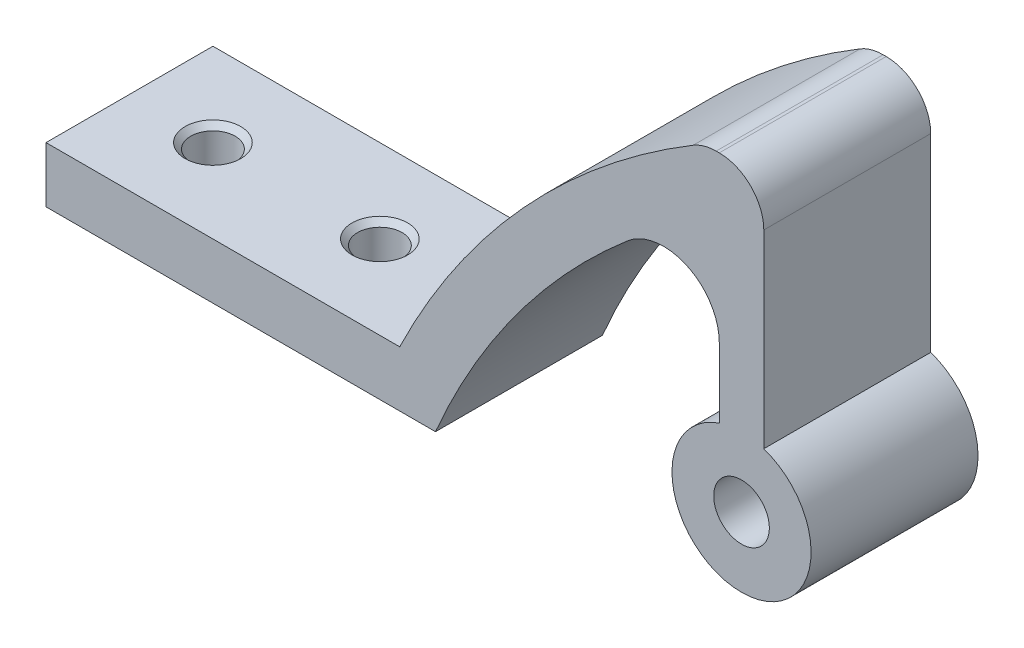
ISO-10303-21;
HEADER;
FILE_DESCRIPTION(('STEP AP214'),'2;1');
FILE_NAME('part.step','',(''),(''),'','','');
FILE_SCHEMA(('AUTOMOTIVE_DESIGN { 1 0 10303 214 1 1 1 1 }'));
ENDSEC;
DATA;
#1=APPLICATION_CONTEXT('core data for automotive mechanical design processes');
#2=APPLICATION_PROTOCOL_DEFINITION('international standard','automotive_design',2000,#1);
#3=PRODUCT_CONTEXT('',#1,'mechanical');
#4=PRODUCT('Part','Part','',(#3));
#5=PRODUCT_RELATED_PRODUCT_CATEGORY('part','',(#4));
#6=PRODUCT_DEFINITION_FORMATION('','',#4);
#7=PRODUCT_DEFINITION_CONTEXT('part definition',#1,'design');
#8=PRODUCT_DEFINITION('design','',#6,#7);
#9=PRODUCT_DEFINITION_SHAPE('','',#8);
#10=(LENGTH_UNIT() NAMED_UNIT(*) SI_UNIT(.MILLI.,.METRE.));
#11=(NAMED_UNIT(*) PLANE_ANGLE_UNIT() SI_UNIT($,.RADIAN.));
#12=(NAMED_UNIT(*) SI_UNIT($,.STERADIAN.) SOLID_ANGLE_UNIT());
#13=UNCERTAINTY_MEASURE_WITH_UNIT(LENGTH_MEASURE(1.E-05),#10,'distance_accuracy_value','');
#14=(GEOMETRIC_REPRESENTATION_CONTEXT(3) GLOBAL_UNCERTAINTY_ASSIGNED_CONTEXT((#13)) GLOBAL_UNIT_ASSIGNED_CONTEXT((#10,
#11,#12)) REPRESENTATION_CONTEXT('',''));
#15=CARTESIAN_POINT('',(0.,0.,0.));
#16=DIRECTION('',(0.,0.,1.));
#17=DIRECTION('',(1.,0.,0.));
#18=AXIS2_PLACEMENT_3D('',#15,#16,#17);
#19=CARTESIAN_POINT('',(0.,5.,0.));
#20=DIRECTION('',(0.,1.,0.));
#21=DIRECTION('',(0.,0.,1.));
#22=AXIS2_PLACEMENT_3D('',#19,#20,#21);
#23=PLANE('',#22);
#24=CARTESIAN_POINT('',(5.,5.,0.));
#25=DIRECTION('',(0.,1.,0.));
#26=DIRECTION('',(0.,0.,1.));
#27=AXIS2_PLACEMENT_3D('',#24,#25,#26);
#28=CIRCLE('',#27,2.50000000000002);
#29=CARTESIAN_POINT('',(5.,5.,2.50000000000002));
#30=VERTEX_POINT('',#29);
#31=EDGE_CURVE('E49',#30,#30,#28,.F.);
#32=ORIENTED_EDGE('',*,*,#31,.T.);
#33=EDGE_LOOP('',(#32));
#34=FACE_BOUND('',#33,.T.);
#35=CARTESIAN_POINT('',(-10.,5.,0.));
#36=DIRECTION('',(0.,1.,0.));
#37=DIRECTION('',(0.,0.,1.));
#38=AXIS2_PLACEMENT_3D('',#35,#36,#37);
#39=CIRCLE('',#38,2.50000000000002);
#40=CARTESIAN_POINT('',(-10.,5.,2.50000000000002));
#41=VERTEX_POINT('',#40);
#42=EDGE_CURVE('E216',#41,#41,#39,.F.);
#43=ORIENTED_EDGE('',*,*,#42,.T.);
#44=EDGE_LOOP('',(#43));
#45=FACE_BOUND('',#44,.T.);
#46=DIRECTION('',(0.,0.,1.));
#47=VECTOR('',#46,1.);
#48=CARTESIAN_POINT('',(14.2847197685974,5.,-7.5));
#49=LINE('',#48,#47);
#50=CARTESIAN_POINT('',(14.2847197685974,5.,-7.5));
#51=VERTEX_POINT('',#50);
#52=CARTESIAN_POINT('',(14.2847197685974,5.,7.5));
#53=VERTEX_POINT('',#52);
#54=EDGE_CURVE('E60',#51,#53,#49,.T.);
#55=ORIENTED_EDGE('',*,*,#54,.F.);
#56=DIRECTION('',(-1.,0.,0.));
#57=VECTOR('',#56,1.);
#58=CARTESIAN_POINT('',(17.5,5.,-7.5));
#59=LINE('',#58,#57);
#60=CARTESIAN_POINT('',(-17.5,5.,-7.5));
#61=VERTEX_POINT('',#60);
#62=EDGE_CURVE('E195',#51,#61,#59,.T.);
#63=ORIENTED_EDGE('',*,*,#62,.T.);
#64=DIRECTION('',(0.,0.,1.));
#65=VECTOR('',#64,1.);
#66=CARTESIAN_POINT('',(-17.5,5.,7.5));
#67=LINE('',#66,#65);
#68=CARTESIAN_POINT('',(-17.5,5.,7.5));
#69=VERTEX_POINT('',#68);
#70=EDGE_CURVE('E191',#61,#69,#67,.T.);
#71=ORIENTED_EDGE('',*,*,#70,.T.);
#72=DIRECTION('',(1.,0.,0.));
#73=VECTOR('',#72,1.);
#74=CARTESIAN_POINT('',(17.5,5.,7.5));
#75=LINE('',#74,#73);
#76=EDGE_CURVE('E56',#69,#53,#75,.T.);
#77=ORIENTED_EDGE('',*,*,#76,.T.);
#78=EDGE_LOOP('',(#55,#63,#71,#77));
#79=FACE_BOUND('',#78,.T.);
#80=ADVANCED_FACE('F40',(#34,#45,#79),#23,.T.);
#81=CARTESIAN_POINT('',(0.,0.,0.));
#82=DIRECTION('',(0.,1.,0.));
#83=DIRECTION('',(0.,0.,1.));
#84=AXIS2_PLACEMENT_3D('',#81,#82,#83);
#85=PLANE('',#84);
#86=DIRECTION('',(0.,0.,1.));
#87=VECTOR('',#86,1.);
#88=CARTESIAN_POINT('',(-17.5,0.,7.5));
#89=LINE('',#88,#87);
#90=CARTESIAN_POINT('',(-17.5,0.,-7.5));
#91=VERTEX_POINT('',#90);
#92=CARTESIAN_POINT('',(-17.5,0.,7.5));
#93=VERTEX_POINT('',#92);
#94=EDGE_CURVE('E190',#91,#93,#89,.T.);
#95=ORIENTED_EDGE('',*,*,#94,.F.);
#96=DIRECTION('',(-1.,0.,0.));
#97=VECTOR('',#96,1.);
#98=CARTESIAN_POINT('',(17.5,0.,-7.5));
#99=LINE('',#98,#97);
#100=CARTESIAN_POINT('',(17.5,0.,-7.5));
#101=VERTEX_POINT('',#100);
#102=EDGE_CURVE('E193',#101,#91,#99,.T.);
#103=ORIENTED_EDGE('',*,*,#102,.F.);
#104=DIRECTION('',(0.,0.,-1.));
#105=VECTOR('',#104,1.);
#106=CARTESIAN_POINT('',(17.5,0.,7.5));
#107=LINE('',#106,#105);
#108=CARTESIAN_POINT('',(17.5,0.,7.5));
#109=VERTEX_POINT('',#108);
#110=EDGE_CURVE('E202',#109,#101,#107,.T.);
#111=ORIENTED_EDGE('',*,*,#110,.F.);
#112=DIRECTION('',(1.,0.,0.));
#113=VECTOR('',#112,1.);
#114=CARTESIAN_POINT('',(17.5,0.,7.5));
#115=LINE('',#114,#113);
#116=EDGE_CURVE('E200',#93,#109,#115,.T.);
#117=ORIENTED_EDGE('',*,*,#116,.F.);
#118=EDGE_LOOP('',(#95,#103,#111,#117));
#119=FACE_BOUND('',#118,.T.);
#120=CARTESIAN_POINT('',(-10.,0.,0.));
#121=DIRECTION('',(0.,1.,0.));
#122=DIRECTION('',(0.,0.,1.));
#123=AXIS2_PLACEMENT_3D('',#120,#121,#122);
#124=CIRCLE('',#123,2.);
#125=CARTESIAN_POINT('',(-10.,0.,2.));
#126=VERTEX_POINT('',#125);
#127=EDGE_CURVE('E187',#126,#126,#124,.T.);
#128=ORIENTED_EDGE('',*,*,#127,.T.);
#129=EDGE_LOOP('',(#128));
#130=FACE_BOUND('',#129,.T.);
#131=CARTESIAN_POINT('',(5.,0.,0.));
#132=DIRECTION('',(0.,1.,0.));
#133=DIRECTION('',(0.,0.,1.));
#134=AXIS2_PLACEMENT_3D('',#131,#132,#133);
#135=CIRCLE('',#134,2.);
#136=CARTESIAN_POINT('',(5.,0.,2.));
#137=VERTEX_POINT('',#136);
#138=EDGE_CURVE('E184',#137,#137,#135,.T.);
#139=ORIENTED_EDGE('',*,*,#138,.T.);
#140=EDGE_LOOP('',(#139));
#141=FACE_BOUND('',#140,.T.);
#142=ADVANCED_FACE('F237',(#119,#130,#141),#85,.F.);
#143=CARTESIAN_POINT('',(-17.5,5.,7.5));
#144=DIRECTION('',(1.,0.,0.));
#145=DIRECTION('',(0.,0.,-1.));
#146=AXIS2_PLACEMENT_3D('',#143,#144,#145);
#147=PLANE('',#146);
#148=ORIENTED_EDGE('',*,*,#94,.T.);
#149=DIRECTION('',(0.,-1.,0.));
#150=VECTOR('',#149,1.);
#151=CARTESIAN_POINT('',(-17.5,5.,7.5));
#152=LINE('',#151,#150);
#153=EDGE_CURVE('E208',#69,#93,#152,.T.);
#154=ORIENTED_EDGE('',*,*,#153,.F.);
#155=ORIENTED_EDGE('',*,*,#70,.F.);
#156=DIRECTION('',(0.,-1.,0.));
#157=VECTOR('',#156,1.);
#158=CARTESIAN_POINT('',(-17.5,5.,-7.5));
#159=LINE('',#158,#157);
#160=EDGE_CURVE('E197',#61,#91,#159,.T.);
#161=ORIENTED_EDGE('',*,*,#160,.T.);
#162=EDGE_LOOP('',(#148,#154,#155,#161));
#163=FACE_BOUND('',#162,.T.);
#164=ADVANCED_FACE('F239',(#163),#147,.F.);
#165=CARTESIAN_POINT('',(17.5,5.,7.5));
#166=DIRECTION('',(0.,0.,-1.));
#167=DIRECTION('',(-1.,0.,0.));
#168=AXIS2_PLACEMENT_3D('',#165,#166,#167);
#169=PLANE('',#168);
#170=CARTESIAN_POINT('',(45.,7.50000000000096,7.5));
#171=DIRECTION('',(0.,0.,1.));
#172=DIRECTION('',(1.,0.,0.));
#173=AXIS2_PLACEMENT_3D('',#170,#171,#172);
#174=CIRCLE('',#173,2.49999999999973);
#175=CARTESIAN_POINT('',(47.4999999999997,7.50000000000096,7.5));
#176=VERTEX_POINT('',#175);
#177=EDGE_CURVE('E270',#176,#176,#174,.T.);
#178=ORIENTED_EDGE('',*,*,#177,.F.);
#179=EDGE_LOOP('',(#178));
#180=FACE_BOUND('',#179,.T.);
#181=DIRECTION('',(0.,-1.,0.));
#182=VECTOR('',#181,1.);
#183=CARTESIAN_POINT('',(42.9999999999991,19.6771235186588,7.5));
#184=LINE('',#183,#182);
#185=CARTESIAN_POINT('',(42.9999999999991,19.6771235186588,7.5));
#186=VERTEX_POINT('',#185);
#187=CARTESIAN_POINT('',(42.9999999999991,13.4213596411639,7.5));
#188=VERTEX_POINT('',#187);
#189=EDGE_CURVE('E147',#186,#188,#184,.T.);
#190=ORIENTED_EDGE('',*,*,#189,.T.);
#191=CARTESIAN_POINT('',(45.,7.50000000000096,7.5));
#192=DIRECTION('',(0.,0.,1.));
#193=DIRECTION('',(1.,0.,0.));
#194=AXIS2_PLACEMENT_3D('',#191,#192,#193);
#195=CIRCLE('',#194,6.24999999999973);
#196=CARTESIAN_POINT('',(47.0000000000009,13.4213596411639,7.5));
#197=VERTEX_POINT('',#196);
#198=EDGE_CURVE('E130',#188,#197,#195,.T.);
#199=ORIENTED_EDGE('',*,*,#198,.T.);
#200=DIRECTION('',(0.,1.,0.));
#201=VECTOR('',#200,1.);
#202=CARTESIAN_POINT('',(47.0000000000009,30.4483700398817,7.5));
#203=LINE('',#202,#201);
#204=CARTESIAN_POINT('',(47.0000000000009,30.4483700398817,7.5));
#205=VERTEX_POINT('',#204);
#206=EDGE_CURVE('E143',#197,#205,#203,.T.);
#207=ORIENTED_EDGE('',*,*,#206,.T.);
#208=CARTESIAN_POINT('',(43.0000000000009,30.4483700398817,7.5));
#209=DIRECTION('',(0.,0.,1.));
#210=DIRECTION('',(-1.,0.,0.));
#211=AXIS2_PLACEMENT_3D('',#208,#209,#210);
#212=CIRCLE('',#211,4.00000000000001);
#213=CARTESIAN_POINT('',(43.0000000000009,34.4483700398817,7.5));
#214=VERTEX_POINT('',#213);
#215=EDGE_CURVE('E154',#205,#214,#212,.T.);
#216=ORIENTED_EDGE('',*,*,#215,.T.);
#217=DIRECTION('',(-1.,0.,0.));
#218=VECTOR('',#217,1.);
#219=CARTESIAN_POINT('',(42.7208863051274,34.4483700398817,7.5));
#220=LINE('',#219,#218);
#221=CARTESIAN_POINT('',(42.7208863051274,34.4483700398817,7.5));
#222=VERTEX_POINT('',#221);
#223=EDGE_CURVE('E156',#214,#222,#220,.T.);
#224=ORIENTED_EDGE('',*,*,#223,.T.);
#225=CARTESIAN_POINT('',(42.7208863051274,30.4483700398817,7.5));
#226=DIRECTION('',(0.,0.,1.));
#227=DIRECTION('',(1.,0.,0.));
#228=AXIS2_PLACEMENT_3D('',#225,#226,#227);
#229=CIRCLE('',#228,4.00000000000001);
#230=CARTESIAN_POINT('',(40.6567686169948,33.8746534737993,7.5));
#231=VERTEX_POINT('',#230);
#232=EDGE_CURVE('E164',#222,#231,#229,.T.);
#233=ORIENTED_EDGE('',*,*,#232,.T.);
#234=CARTESIAN_POINT('',(76.1249999999996,-25.0000000000006,7.5));
#235=DIRECTION('',(0.,0.,1.));
#236=DIRECTION('',(1.,0.,0.));
#237=AXIS2_PLACEMENT_3D('',#234,#235,#236);
#238=CIRCLE('',#237,68.7329634098399);
#239=EDGE_CURVE('E167',#231,#53,#238,.T.);
#240=ORIENTED_EDGE('',*,*,#239,.T.);
#241=ORIENTED_EDGE('',*,*,#76,.F.);
#242=ORIENTED_EDGE('',*,*,#153,.T.);
#243=ORIENTED_EDGE('',*,*,#116,.T.);
#244=CARTESIAN_POINT('',(76.1249999999996,-25.0000000000006,7.5));
#245=DIRECTION('',(0.,0.,-1.));
#246=DIRECTION('',(1.,0.,0.));
#247=AXIS2_PLACEMENT_3D('',#244,#245,#246);
#248=CIRCLE('',#247,63.7329634098398);
#249=CARTESIAN_POINT('',(34.75437796881,23.4805348336049,7.5));
#250=VERTEX_POINT('',#249);
#251=EDGE_CURVE('E137',#109,#250,#248,.T.);
#252=ORIENTED_EDGE('',*,*,#251,.T.);
#253=CARTESIAN_POINT('',(37.9999999999991,19.6771235186588,7.5));
#254=DIRECTION('',(0.,0.,-1.));
#255=DIRECTION('',(1.,0.,0.));
#256=AXIS2_PLACEMENT_3D('',#253,#254,#255);
#257=CIRCLE('',#256,4.99999999999999);
#258=EDGE_CURVE('E158',#250,#186,#257,.T.);
#259=ORIENTED_EDGE('',*,*,#258,.T.);
#260=EDGE_LOOP('',(#190,#199,#207,#216,#224,#233,#240,#241,#242,#243,#252,#259));
#261=FACE_BOUND('',#260,.T.);
#262=ADVANCED_FACE('F141',(#180,#261),#169,.F.);
#263=CARTESIAN_POINT('',(17.5,5.,-7.5));
#264=DIRECTION('',(0.,0.,1.));
#265=DIRECTION('',(1.,0.,0.));
#266=AXIS2_PLACEMENT_3D('',#263,#264,#265);
#267=PLANE('',#266);
#268=CARTESIAN_POINT('',(45.,7.50000000000096,-7.5));
#269=DIRECTION('',(0.,0.,1.));
#270=DIRECTION('',(1.,0.,0.));
#271=AXIS2_PLACEMENT_3D('',#268,#269,#270);
#272=CIRCLE('',#271,2.49999999999973);
#273=CARTESIAN_POINT('',(47.4999999999997,7.50000000000096,-7.5));
#274=VERTEX_POINT('',#273);
#275=EDGE_CURVE('E148',#274,#274,#272,.T.);
#276=ORIENTED_EDGE('',*,*,#275,.T.);
#277=EDGE_LOOP('',(#276));
#278=FACE_BOUND('',#277,.T.);
#279=DIRECTION('',(0.,1.,0.));
#280=VECTOR('',#279,1.);
#281=CARTESIAN_POINT('',(47.0000000000009,30.4483700398817,-7.5));
#282=LINE('',#281,#280);
#283=CARTESIAN_POINT('',(47.0000000000009,13.4213596411639,-7.5));
#284=VERTEX_POINT('',#283);
#285=CARTESIAN_POINT('',(47.0000000000009,30.4483700398817,-7.5));
#286=VERTEX_POINT('',#285);
#287=EDGE_CURVE('E285',#284,#286,#282,.T.);
#288=ORIENTED_EDGE('',*,*,#287,.F.);
#289=CARTESIAN_POINT('',(45.,7.50000000000096,-7.5));
#290=DIRECTION('',(0.,0.,1.));
#291=DIRECTION('',(1.,0.,0.));
#292=AXIS2_PLACEMENT_3D('',#289,#290,#291);
#293=CIRCLE('',#292,6.24999999999973);
#294=CARTESIAN_POINT('',(42.9999999999991,13.4213596411639,-7.5));
#295=VERTEX_POINT('',#294);
#296=EDGE_CURVE('E133',#295,#284,#293,.T.);
#297=ORIENTED_EDGE('',*,*,#296,.F.);
#298=DIRECTION('',(0.,-1.,0.));
#299=VECTOR('',#298,1.);
#300=CARTESIAN_POINT('',(42.9999999999991,19.6771235186588,-7.5));
#301=LINE('',#300,#299);
#302=CARTESIAN_POINT('',(42.9999999999991,19.6771235186588,-7.5));
#303=VERTEX_POINT('',#302);
#304=EDGE_CURVE('E282',#303,#295,#301,.T.);
#305=ORIENTED_EDGE('',*,*,#304,.F.);
#306=CARTESIAN_POINT('',(37.9999999999991,19.6771235186588,-7.5));
#307=DIRECTION('',(0.,0.,-1.));
#308=DIRECTION('',(1.,0.,0.));
#309=AXIS2_PLACEMENT_3D('',#306,#307,#308);
#310=CIRCLE('',#309,4.99999999999999);
#311=CARTESIAN_POINT('',(34.75437796881,23.4805348336049,-7.5));
#312=VERTEX_POINT('',#311);
#313=EDGE_CURVE('E279',#312,#303,#310,.T.);
#314=ORIENTED_EDGE('',*,*,#313,.F.);
#315=CARTESIAN_POINT('',(76.1249999999996,-25.0000000000006,-7.5));
#316=DIRECTION('',(0.,0.,-1.));
#317=DIRECTION('',(1.,0.,0.));
#318=AXIS2_PLACEMENT_3D('',#315,#316,#317);
#319=CIRCLE('',#318,63.7329634098398);
#320=EDGE_CURVE('E170',#101,#312,#319,.T.);
#321=ORIENTED_EDGE('',*,*,#320,.F.);
#322=ORIENTED_EDGE('',*,*,#102,.T.);
#323=ORIENTED_EDGE('',*,*,#160,.F.);
#324=ORIENTED_EDGE('',*,*,#62,.F.);
#325=CARTESIAN_POINT('',(76.1249999999996,-25.0000000000006,-7.5));
#326=DIRECTION('',(0.,0.,1.));
#327=DIRECTION('',(1.,0.,0.));
#328=AXIS2_PLACEMENT_3D('',#325,#326,#327);
#329=CIRCLE('',#328,68.7329634098399);
#330=CARTESIAN_POINT('',(40.6567686169948,33.8746534737993,-7.5));
#331=VERTEX_POINT('',#330);
#332=EDGE_CURVE('E182',#331,#51,#329,.T.);
#333=ORIENTED_EDGE('',*,*,#332,.F.);
#334=CARTESIAN_POINT('',(42.7208863051274,30.4483700398817,-7.5));
#335=DIRECTION('',(0.,0.,1.));
#336=DIRECTION('',(1.,0.,0.));
#337=AXIS2_PLACEMENT_3D('',#334,#335,#336);
#338=CIRCLE('',#337,4.00000000000001);
#339=CARTESIAN_POINT('',(42.7208863051274,34.4483700398817,-7.5));
#340=VERTEX_POINT('',#339);
#341=EDGE_CURVE('E293',#340,#331,#338,.T.);
#342=ORIENTED_EDGE('',*,*,#341,.F.);
#343=DIRECTION('',(-1.,0.,0.));
#344=VECTOR('',#343,1.);
#345=CARTESIAN_POINT('',(42.7208863051274,34.4483700398817,-7.5));
#346=LINE('',#345,#344);
#347=CARTESIAN_POINT('',(43.0000000000009,34.4483700398817,-7.5));
#348=VERTEX_POINT('',#347);
#349=EDGE_CURVE('E290',#348,#340,#346,.T.);
#350=ORIENTED_EDGE('',*,*,#349,.F.);
#351=CARTESIAN_POINT('',(43.0000000000009,30.4483700398817,-7.5));
#352=DIRECTION('',(0.,0.,1.));
#353=DIRECTION('',(-1.,0.,0.));
#354=AXIS2_PLACEMENT_3D('',#351,#352,#353);
#355=CIRCLE('',#354,4.00000000000001);
#356=EDGE_CURVE('E287',#286,#348,#355,.T.);
#357=ORIENTED_EDGE('',*,*,#356,.F.);
#358=EDGE_LOOP('',(#288,#297,#305,#314,#321,#322,#323,#324,#333,#342,#350,#357));
#359=FACE_BOUND('',#358,.T.);
#360=ADVANCED_FACE('F254',(#278,#359),#267,.F.);
#361=CARTESIAN_POINT('',(-10.,5.,0.));
#362=DIRECTION('',(0.,-1.,0.));
#363=DIRECTION('',(0.,0.,-1.));
#364=AXIS2_PLACEMENT_3D('',#361,#362,#363);
#365=CYLINDRICAL_SURFACE('',#364,2.);
#366=CARTESIAN_POINT('',(-10.,4.49999999999999,0.));
#367=DIRECTION('',(0.,1.,0.));
#368=DIRECTION('',(0.,0.,1.));
#369=AXIS2_PLACEMENT_3D('',#366,#367,#368);
#370=CIRCLE('',#369,2.);
#371=CARTESIAN_POINT('',(-10.,4.49999999999999,2.));
#372=VERTEX_POINT('',#371);
#373=EDGE_CURVE('E11',#372,#372,#370,.T.);
#374=ORIENTED_EDGE('',*,*,#373,.T.);
#375=EDGE_LOOP('',(#374));
#376=FACE_BOUND('',#375,.T.);
#377=ORIENTED_EDGE('',*,*,#127,.F.);
#378=EDGE_LOOP('',(#377));
#379=FACE_BOUND('',#378,.T.);
#380=ADVANCED_FACE('F233',(#376,#379),#365,.F.);
#381=CARTESIAN_POINT('',(5.,5.,0.));
#382=DIRECTION('',(0.,-1.,0.));
#383=DIRECTION('',(0.,0.,-1.));
#384=AXIS2_PLACEMENT_3D('',#381,#382,#383);
#385=CYLINDRICAL_SURFACE('',#384,2.);
#386=CARTESIAN_POINT('',(5.,4.49999999999999,0.));
#387=DIRECTION('',(0.,1.,0.));
#388=DIRECTION('',(0.,0.,1.));
#389=AXIS2_PLACEMENT_3D('',#386,#387,#388);
#390=CIRCLE('',#389,2.);
#391=CARTESIAN_POINT('',(5.,4.49999999999999,2.));
#392=VERTEX_POINT('',#391);
#393=EDGE_CURVE('E213',#392,#392,#390,.T.);
#394=ORIENTED_EDGE('',*,*,#393,.T.);
#395=EDGE_LOOP('',(#394));
#396=FACE_BOUND('',#395,.T.);
#397=ORIENTED_EDGE('',*,*,#138,.F.);
#398=EDGE_LOOP('',(#397));
#399=FACE_BOUND('',#398,.T.);
#400=ADVANCED_FACE('F229',(#396,#399),#385,.F.);
#401=CARTESIAN_POINT('',(76.1249999999996,-25.0000000000006,-7.5));
#402=DIRECTION('',(0.,0.,1.));
#403=DIRECTION('',(1.,0.,0.));
#404=AXIS2_PLACEMENT_3D('',#401,#402,#403);
#405=CYLINDRICAL_SURFACE('',#404,63.7329634098398);
#406=ORIENTED_EDGE('',*,*,#251,.F.);
#407=ORIENTED_EDGE('',*,*,#110,.T.);
#408=ORIENTED_EDGE('',*,*,#320,.T.);
#409=DIRECTION('',(0.,0.,1.));
#410=VECTOR('',#409,1.);
#411=CARTESIAN_POINT('',(34.75437796881,23.4805348336049,-7.5));
#412=LINE('',#411,#410);
#413=EDGE_CURVE('E180',#312,#250,#412,.T.);
#414=ORIENTED_EDGE('',*,*,#413,.T.);
#415=EDGE_LOOP('',(#406,#407,#408,#414));
#416=FACE_BOUND('',#415,.T.);
#417=ADVANCED_FACE('F232',(#416),#405,.F.);
#418=CARTESIAN_POINT('',(76.1249999999996,-25.0000000000006,-7.5));
#419=DIRECTION('',(0.,0.,1.));
#420=DIRECTION('',(1.,0.,0.));
#421=AXIS2_PLACEMENT_3D('',#418,#419,#420);
#422=CYLINDRICAL_SURFACE('',#421,68.7329634098399);
#423=ORIENTED_EDGE('',*,*,#332,.T.);
#424=ORIENTED_EDGE('',*,*,#54,.T.);
#425=ORIENTED_EDGE('',*,*,#239,.F.);
#426=DIRECTION('',(0.,0.,1.));
#427=VECTOR('',#426,1.);
#428=CARTESIAN_POINT('',(40.6567686169948,33.8746534737993,-7.5));
#429=LINE('',#428,#427);
#430=EDGE_CURVE('E171',#331,#231,#429,.T.);
#431=ORIENTED_EDGE('',*,*,#430,.F.);
#432=EDGE_LOOP('',(#423,#424,#425,#431));
#433=FACE_BOUND('',#432,.T.);
#434=ADVANCED_FACE('F322',(#433),#422,.T.);
#435=CARTESIAN_POINT('',(42.7208863051274,30.4483700398817,-7.5));
#436=DIRECTION('',(0.,0.,1.));
#437=DIRECTION('',(1.,0.,0.));
#438=AXIS2_PLACEMENT_3D('',#435,#436,#437);
#439=CYLINDRICAL_SURFACE('',#438,4.00000000000001);
#440=ORIENTED_EDGE('',*,*,#232,.F.);
#441=DIRECTION('',(0.,0.,1.));
#442=VECTOR('',#441,1.);
#443=CARTESIAN_POINT('',(42.7208863051274,34.4483700398817,-7.5));
#444=LINE('',#443,#442);
#445=EDGE_CURVE('E173',#340,#222,#444,.T.);
#446=ORIENTED_EDGE('',*,*,#445,.F.);
#447=ORIENTED_EDGE('',*,*,#341,.T.);
#448=ORIENTED_EDGE('',*,*,#430,.T.);
#449=EDGE_LOOP('',(#440,#446,#447,#448));
#450=FACE_BOUND('',#449,.T.);
#451=ADVANCED_FACE('F318',(#450),#439,.T.);
#452=CARTESIAN_POINT('',(42.7208863051274,34.4483700398817,-7.5));
#453=DIRECTION('',(0.,1.,0.));
#454=DIRECTION('',(0.,0.,1.));
#455=AXIS2_PLACEMENT_3D('',#452,#453,#454);
#456=PLANE('',#455);
#457=ORIENTED_EDGE('',*,*,#223,.F.);
#458=DIRECTION('',(0.,0.,1.));
#459=VECTOR('',#458,1.);
#460=CARTESIAN_POINT('',(43.0000000000009,34.4483700398817,-7.5));
#461=LINE('',#460,#459);
#462=EDGE_CURVE('E175',#348,#214,#461,.T.);
#463=ORIENTED_EDGE('',*,*,#462,.F.);
#464=ORIENTED_EDGE('',*,*,#349,.T.);
#465=ORIENTED_EDGE('',*,*,#445,.T.);
#466=EDGE_LOOP('',(#457,#463,#464,#465));
#467=FACE_BOUND('',#466,.T.);
#468=ADVANCED_FACE('F315',(#467),#456,.T.);
#469=CARTESIAN_POINT('',(43.0000000000009,30.4483700398817,-7.5));
#470=DIRECTION('',(0.,0.,1.));
#471=DIRECTION('',(1.,0.,0.));
#472=AXIS2_PLACEMENT_3D('',#469,#470,#471);
#473=CYLINDRICAL_SURFACE('',#472,4.00000000000001);
#474=ORIENTED_EDGE('',*,*,#215,.F.);
#475=DIRECTION('',(0.,0.,1.));
#476=VECTOR('',#475,1.);
#477=CARTESIAN_POINT('',(47.0000000000009,30.4483700398817,-7.5));
#478=LINE('',#477,#476);
#479=EDGE_CURVE('E152',#286,#205,#478,.T.);
#480=ORIENTED_EDGE('',*,*,#479,.F.);
#481=ORIENTED_EDGE('',*,*,#356,.T.);
#482=ORIENTED_EDGE('',*,*,#462,.T.);
#483=EDGE_LOOP('',(#474,#480,#481,#482));
#484=FACE_BOUND('',#483,.T.);
#485=ADVANCED_FACE('F311',(#484),#473,.T.);
#486=CARTESIAN_POINT('',(47.0000000000009,30.4483700398817,-7.5));
#487=DIRECTION('',(1.,0.,0.));
#488=DIRECTION('',(0.,0.,-1.));
#489=AXIS2_PLACEMENT_3D('',#486,#487,#488);
#490=PLANE('',#489);
#491=DIRECTION('',(0.,0.,1.));
#492=VECTOR('',#491,1.);
#493=CARTESIAN_POINT('',(47.0000000000009,13.4213596411639,-7.5));
#494=LINE('',#493,#492);
#495=EDGE_CURVE('E127',#284,#197,#494,.T.);
#496=ORIENTED_EDGE('',*,*,#495,.F.);
#497=ORIENTED_EDGE('',*,*,#287,.T.);
#498=ORIENTED_EDGE('',*,*,#479,.T.);
#499=ORIENTED_EDGE('',*,*,#206,.F.);
#500=EDGE_LOOP('',(#496,#497,#498,#499));
#501=FACE_BOUND('',#500,.T.);
#502=ADVANCED_FACE('F150',(#501),#490,.T.);
#503=CARTESIAN_POINT('',(42.9999999999991,19.6771235186588,-7.5));
#504=DIRECTION('',(-1.,0.,0.));
#505=DIRECTION('',(0.,0.,1.));
#506=AXIS2_PLACEMENT_3D('',#503,#504,#505);
#507=PLANE('',#506);
#508=DIRECTION('',(0.,0.,1.));
#509=VECTOR('',#508,1.);
#510=CARTESIAN_POINT('',(42.9999999999991,13.4213596411639,-7.5));
#511=LINE('',#510,#509);
#512=EDGE_CURVE('E211',#188,#295,#511,.F.);
#513=ORIENTED_EDGE('',*,*,#512,.F.);
#514=ORIENTED_EDGE('',*,*,#189,.F.);
#515=DIRECTION('',(0.,0.,1.));
#516=VECTOR('',#515,1.);
#517=CARTESIAN_POINT('',(42.9999999999991,19.6771235186588,-7.5));
#518=LINE('',#517,#516);
#519=EDGE_CURVE('E178',#303,#186,#518,.T.);
#520=ORIENTED_EDGE('',*,*,#519,.F.);
#521=ORIENTED_EDGE('',*,*,#304,.T.);
#522=EDGE_LOOP('',(#513,#514,#520,#521));
#523=FACE_BOUND('',#522,.T.);
#524=ADVANCED_FACE('F306',(#523),#507,.T.);
#525=CARTESIAN_POINT('',(37.9999999999991,19.6771235186588,-7.5));
#526=DIRECTION('',(0.,0.,1.));
#527=DIRECTION('',(1.,0.,0.));
#528=AXIS2_PLACEMENT_3D('',#525,#526,#527);
#529=CYLINDRICAL_SURFACE('',#528,4.99999999999999);
#530=ORIENTED_EDGE('',*,*,#258,.F.);
#531=ORIENTED_EDGE('',*,*,#413,.F.);
#532=ORIENTED_EDGE('',*,*,#313,.T.);
#533=ORIENTED_EDGE('',*,*,#519,.T.);
#534=EDGE_LOOP('',(#530,#531,#532,#533));
#535=FACE_BOUND('',#534,.T.);
#536=ADVANCED_FACE('F302',(#535),#529,.F.);
#537=CARTESIAN_POINT('',(45.,7.50000000000096,-7.5));
#538=DIRECTION('',(0.,0.,1.));
#539=DIRECTION('',(1.,0.,0.));
#540=AXIS2_PLACEMENT_3D('',#537,#538,#539);
#541=CYLINDRICAL_SURFACE('',#540,6.24999999999973);
#542=ORIENTED_EDGE('',*,*,#296,.T.);
#543=ORIENTED_EDGE('',*,*,#495,.T.);
#544=ORIENTED_EDGE('',*,*,#198,.F.);
#545=ORIENTED_EDGE('',*,*,#512,.T.);
#546=EDGE_LOOP('',(#542,#543,#544,#545));
#547=FACE_BOUND('',#546,.T.);
#548=ADVANCED_FACE('F129',(#547),#541,.T.);
#549=CARTESIAN_POINT('',(45.,7.50000000000096,-7.5));
#550=DIRECTION('',(0.,0.,1.));
#551=DIRECTION('',(1.,0.,0.));
#552=AXIS2_PLACEMENT_3D('',#549,#550,#551);
#553=CYLINDRICAL_SURFACE('',#552,2.49999999999973);
#554=ORIENTED_EDGE('',*,*,#275,.F.);
#555=EDGE_LOOP('',(#554));
#556=FACE_BOUND('',#555,.T.);
#557=ORIENTED_EDGE('',*,*,#177,.T.);
#558=EDGE_LOOP('',(#557));
#559=FACE_BOUND('',#558,.T.);
#560=ADVANCED_FACE('F226',(#556,#559),#553,.F.);
#561=CARTESIAN_POINT('',(5.,4.49999999999999,0.));
#562=DIRECTION('',(0.,1.,0.));
#563=DIRECTION('',(0.,0.,1.));
#564=AXIS2_PLACEMENT_3D('',#561,#562,#563);
#565=CONICAL_SURFACE('',#564,2.,0.785398163397455);
#566=ORIENTED_EDGE('',*,*,#31,.F.);
#567=EDGE_LOOP('',(#566));
#568=FACE_BOUND('',#567,.T.);
#569=ORIENTED_EDGE('',*,*,#393,.F.);
#570=EDGE_LOOP('',(#569));
#571=FACE_BOUND('',#570,.T.);
#572=ADVANCED_FACE('F223',(#568,#571),#565,.F.);
#573=CARTESIAN_POINT('',(-10.,4.49999999999999,0.));
#574=DIRECTION('',(0.,1.,0.));
#575=DIRECTION('',(0.,0.,1.));
#576=AXIS2_PLACEMENT_3D('',#573,#574,#575);
#577=CONICAL_SURFACE('',#576,2.,0.785398163397456);
#578=ORIENTED_EDGE('',*,*,#42,.F.);
#579=EDGE_LOOP('',(#578));
#580=FACE_BOUND('',#579,.T.);
#581=ORIENTED_EDGE('',*,*,#373,.F.);
#582=EDGE_LOOP('',(#581));
#583=FACE_BOUND('',#582,.T.);
#584=ADVANCED_FACE('F43',(#580,#583),#577,.F.);
#585=CLOSED_SHELL('',(#80,#142,#164,#262,#360,#380,#400,#417,#434,#451,#468,#485,#502,#524,#536,
#548,#560,#572,#584));
#586=MANIFOLD_SOLID_BREP('B2',#585);
#587=ADVANCED_BREP_SHAPE_REPRESENTATION('',(#18,#586),#14);
#588=SHAPE_DEFINITION_REPRESENTATION(#9,#587);
ENDSEC;
END-ISO-10303-21;
